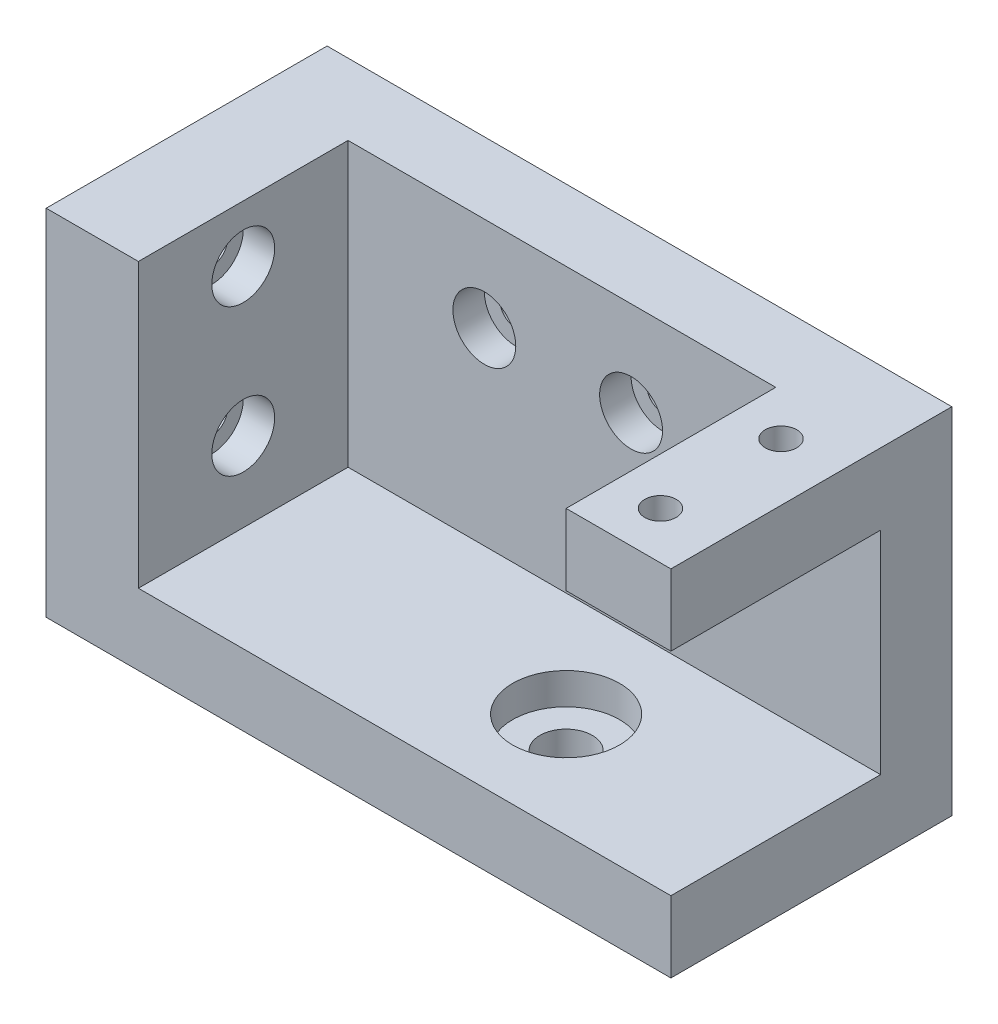
ISO-10303-21;
HEADER;
FILE_DESCRIPTION(('STEP AP214'),'2;1');
FILE_NAME('part.step','',(''),(''),'','','');
FILE_SCHEMA(('AUTOMOTIVE_DESIGN { 1 0 10303 214 1 1 1 1 }'));
ENDSEC;
DATA;
#1=APPLICATION_CONTEXT('core data for automotive mechanical design processes');
#2=APPLICATION_PROTOCOL_DEFINITION('international standard','automotive_design',2000,#1);
#3=PRODUCT_CONTEXT('',#1,'mechanical');
#4=PRODUCT('Part','Part','',(#3));
#5=PRODUCT_RELATED_PRODUCT_CATEGORY('part','',(#4));
#6=PRODUCT_DEFINITION_FORMATION('','',#4);
#7=PRODUCT_DEFINITION_CONTEXT('part definition',#1,'design');
#8=PRODUCT_DEFINITION('design','',#6,#7);
#9=PRODUCT_DEFINITION_SHAPE('','',#8);
#10=(LENGTH_UNIT() NAMED_UNIT(*) SI_UNIT(.MILLI.,.METRE.));
#11=(NAMED_UNIT(*) PLANE_ANGLE_UNIT() SI_UNIT($,.RADIAN.));
#12=(NAMED_UNIT(*) SI_UNIT($,.STERADIAN.) SOLID_ANGLE_UNIT());
#13=UNCERTAINTY_MEASURE_WITH_UNIT(LENGTH_MEASURE(1.E-05),#10,'distance_accuracy_value','');
#14=(GEOMETRIC_REPRESENTATION_CONTEXT(3) GLOBAL_UNCERTAINTY_ASSIGNED_CONTEXT((#13)) GLOBAL_UNIT_ASSIGNED_CONTEXT((#10,
#11,#12)) REPRESENTATION_CONTEXT('',''));
#15=CARTESIAN_POINT('',(0.,0.,0.));
#16=DIRECTION('',(0.,0.,1.));
#17=DIRECTION('',(1.,0.,0.));
#18=AXIS2_PLACEMENT_3D('',#15,#16,#17);
#19=CARTESIAN_POINT('',(-0.0901204819277052,12.9821686746974,3.2));
#20=DIRECTION('',(0.,0.,-1.));
#21=DIRECTION('',(0.,1.,0.));
#22=AXIS2_PLACEMENT_3D('',#19,#20,#21);
#23=CYLINDRICAL_SURFACE('',#22,1.5);
#24=CARTESIAN_POINT('',(-0.0901204819277052,12.9821686746974,-6.8));
#25=DIRECTION('',(0.,0.,-1.));
#26=DIRECTION('',(0.,1.,0.));
#27=AXIS2_PLACEMENT_3D('',#24,#25,#26);
#28=CIRCLE('',#27,1.5);
#29=CARTESIAN_POINT('',(-0.0901204819277052,14.4821686746974,-6.8));
#30=VERTEX_POINT('',#29);
#31=EDGE_CURVE('E177',#30,#30,#28,.T.);
#32=ORIENTED_EDGE('',*,*,#31,.T.);
#33=EDGE_LOOP('',(#32));
#34=FACE_BOUND('',#33,.T.);
#35=CARTESIAN_POINT('',(-0.0901204819277052,12.9821686746974,-3.));
#36=DIRECTION('',(0.,0.,1.));
#37=DIRECTION('',(1.,0.,0.));
#38=AXIS2_PLACEMENT_3D('',#35,#36,#37);
#39=CIRCLE('',#38,1.5);
#40=CARTESIAN_POINT('',(1.4098795180723,12.9821686746974,-3.));
#41=VERTEX_POINT('',#40);
#42=EDGE_CURVE('E47',#41,#41,#39,.F.);
#43=ORIENTED_EDGE('',*,*,#42,.F.);
#44=EDGE_LOOP('',(#43));
#45=FACE_BOUND('',#44,.T.);
#46=ADVANCED_FACE('F43',(#34,#45),#23,.F.);
#47=CARTESIAN_POINT('',(13.9098795180723,12.9821686746974,3.2));
#48=DIRECTION('',(0.,0.,-1.));
#49=DIRECTION('',(0.,1.,0.));
#50=AXIS2_PLACEMENT_3D('',#47,#48,#49);
#51=CYLINDRICAL_SURFACE('',#50,1.5);
#52=CARTESIAN_POINT('',(13.9098795180723,12.9821686746974,-6.8));
#53=DIRECTION('',(0.,0.,-1.));
#54=DIRECTION('',(0.,1.,0.));
#55=AXIS2_PLACEMENT_3D('',#52,#53,#54);
#56=CIRCLE('',#55,1.5);
#57=CARTESIAN_POINT('',(13.9098795180723,14.4821686746974,-6.8));
#58=VERTEX_POINT('',#57);
#59=EDGE_CURVE('E180',#58,#58,#56,.T.);
#60=ORIENTED_EDGE('',*,*,#59,.T.);
#61=EDGE_LOOP('',(#60));
#62=FACE_BOUND('',#61,.T.);
#63=CARTESIAN_POINT('',(13.9098795180723,12.9821686746974,-3.));
#64=DIRECTION('',(0.,0.,1.));
#65=DIRECTION('',(1.,0.,0.));
#66=AXIS2_PLACEMENT_3D('',#63,#64,#65);
#67=CIRCLE('',#66,1.5);
#68=CARTESIAN_POINT('',(15.4098795180723,12.9821686746974,-3.));
#69=VERTEX_POINT('',#68);
#70=EDGE_CURVE('E139',#69,#69,#67,.F.);
#71=ORIENTED_EDGE('',*,*,#70,.F.);
#72=EDGE_LOOP('',(#71));
#73=FACE_BOUND('',#72,.T.);
#74=ADVANCED_FACE('F269',(#62,#73),#51,.F.);
#75=CARTESIAN_POINT('',(-11.8901204819277,16.5821686746975,10.));
#76=DIRECTION('',(-1.,0.,0.));
#77=DIRECTION('',(0.,-1.,0.));
#78=AXIS2_PLACEMENT_3D('',#75,#76,#77);
#79=CYLINDRICAL_SURFACE('',#78,1.5);
#80=CARTESIAN_POINT('',(-21.8901204819277,16.5821686746975,10.));
#81=DIRECTION('',(-1.,0.,0.));
#82=DIRECTION('',(0.,-1.,0.));
#83=AXIS2_PLACEMENT_3D('',#80,#81,#82);
#84=CIRCLE('',#83,1.5);
#85=CARTESIAN_POINT('',(-21.8901204819277,15.0821686746975,10.));
#86=VERTEX_POINT('',#85);
#87=EDGE_CURVE('E138',#86,#86,#84,.T.);
#88=ORIENTED_EDGE('',*,*,#87,.T.);
#89=EDGE_LOOP('',(#88));
#90=FACE_BOUND('',#89,.T.);
#91=CARTESIAN_POINT('',(-16.0901204819277,16.5821686746975,10.));
#92=DIRECTION('',(1.,0.,0.));
#93=DIRECTION('',(0.,1.,0.));
#94=AXIS2_PLACEMENT_3D('',#91,#92,#93);
#95=CIRCLE('',#94,1.5);
#96=CARTESIAN_POINT('',(-16.0901204819277,18.0821686746975,10.));
#97=VERTEX_POINT('',#96);
#98=EDGE_CURVE('E135',#97,#97,#95,.F.);
#99=ORIENTED_EDGE('',*,*,#98,.F.);
#100=EDGE_LOOP('',(#99));
#101=FACE_BOUND('',#100,.T.);
#102=ADVANCED_FACE('F275',(#90,#101),#79,.F.);
#103=CARTESIAN_POINT('',(-11.8901204819278,2.58216867469745,10.));
#104=DIRECTION('',(-1.,0.,0.));
#105=DIRECTION('',(0.,-1.,0.));
#106=AXIS2_PLACEMENT_3D('',#103,#104,#105);
#107=CYLINDRICAL_SURFACE('',#106,1.5);
#108=CARTESIAN_POINT('',(-21.8901204819278,2.58216867469746,10.));
#109=DIRECTION('',(-1.,0.,0.));
#110=DIRECTION('',(0.,-1.,0.));
#111=AXIS2_PLACEMENT_3D('',#108,#109,#110);
#112=CIRCLE('',#111,1.5);
#113=CARTESIAN_POINT('',(-21.8901204819278,1.08216867469746,10.));
#114=VERTEX_POINT('',#113);
#115=EDGE_CURVE('E174',#114,#114,#112,.T.);
#116=ORIENTED_EDGE('',*,*,#115,.T.);
#117=EDGE_LOOP('',(#116));
#118=FACE_BOUND('',#117,.T.);
#119=CARTESIAN_POINT('',(-16.0901204819277,2.58216867469745,10.));
#120=DIRECTION('',(1.,0.,0.));
#121=DIRECTION('',(0.,1.,0.));
#122=AXIS2_PLACEMENT_3D('',#119,#120,#121);
#123=CIRCLE('',#122,1.5);
#124=CARTESIAN_POINT('',(-16.0901204819277,4.08216867469745,10.));
#125=VERTEX_POINT('',#124);
#126=EDGE_CURVE('E132',#125,#125,#123,.F.);
#127=ORIENTED_EDGE('',*,*,#126,.F.);
#128=EDGE_LOOP('',(#127));
#129=FACE_BOUND('',#128,.T.);
#130=ADVANCED_FACE('F264',(#118,#129),#107,.F.);
#131=CARTESIAN_POINT('',(33.7098795180723,21.9821686746975,0.));
#132=DIRECTION('',(0.,0.,-1.));
#133=DIRECTION('',(0.,1.,0.));
#134=AXIS2_PLACEMENT_3D('',#131,#132,#133);
#135=PLANE('',#134);
#136=CARTESIAN_POINT('',(-0.0901204819277052,12.9821686746974,0.));
#137=DIRECTION('',(0.,0.,1.));
#138=DIRECTION('',(1.,0.,0.));
#139=AXIS2_PLACEMENT_3D('',#136,#137,#138);
#140=CIRCLE('',#139,3.);
#141=CARTESIAN_POINT('',(2.9098795180723,12.9821686746974,0.));
#142=VERTEX_POINT('',#141);
#143=EDGE_CURVE('E147',#142,#142,#140,.T.);
#144=ORIENTED_EDGE('',*,*,#143,.F.);
#145=EDGE_LOOP('',(#144));
#146=FACE_BOUND('',#145,.T.);
#147=CARTESIAN_POINT('',(13.9098795180723,12.9821686746974,0.));
#148=DIRECTION('',(0.,0.,1.));
#149=DIRECTION('',(1.,0.,0.));
#150=AXIS2_PLACEMENT_3D('',#147,#148,#149);
#151=CIRCLE('',#150,3.);
#152=CARTESIAN_POINT('',(16.9098795180723,12.9821686746974,0.));
#153=VERTEX_POINT('',#152);
#154=EDGE_CURVE('E160',#153,#153,#151,.T.);
#155=ORIENTED_EDGE('',*,*,#154,.F.);
#156=EDGE_LOOP('',(#155));
#157=FACE_BOUND('',#156,.T.);
#158=DIRECTION('',(0.,1.,0.));
#159=VECTOR('',#158,1.);
#160=CARTESIAN_POINT('',(-13.0901204819277,21.9821686746974,0.));
#161=LINE('',#160,#159);
#162=CARTESIAN_POINT('',(-13.0901204819278,-5.01783132530256,0.));
#163=VERTEX_POINT('',#162);
#164=CARTESIAN_POINT('',(-13.0901204819277,21.9821686746974,0.));
#165=VERTEX_POINT('',#164);
#166=EDGE_CURVE('E60',#163,#165,#161,.T.);
#167=ORIENTED_EDGE('',*,*,#166,.F.);
#168=DIRECTION('',(1.,0.,0.));
#169=VECTOR('',#168,1.);
#170=CARTESIAN_POINT('',(-19.0867425741607,-5.01783132530256,0.));
#171=LINE('',#170,#169);
#172=CARTESIAN_POINT('',(37.7098795180722,-5.0178313253012,0.));
#173=VERTEX_POINT('',#172);
#174=EDGE_CURVE('E206',#163,#173,#171,.T.);
#175=ORIENTED_EDGE('',*,*,#174,.T.);
#176=DIRECTION('',(0.,-1.,0.));
#177=VECTOR('',#176,1.);
#178=CARTESIAN_POINT('',(37.7098795180722,0.,0.));
#179=LINE('',#178,#177);
#180=CARTESIAN_POINT('',(37.7098795180723,15.1821686746974,0.));
#181=VERTEX_POINT('',#180);
#182=EDGE_CURVE('E233',#181,#173,#179,.T.);
#183=ORIENTED_EDGE('',*,*,#182,.F.);
#184=DIRECTION('',(1.,0.,0.));
#185=VECTOR('',#184,1.);
#186=CARTESIAN_POINT('',(-19.0867425741607,15.1821686746974,0.));
#187=LINE('',#186,#185);
#188=CARTESIAN_POINT('',(27.7132574258393,15.1821686746974,0.));
#189=VERTEX_POINT('',#188);
#190=EDGE_CURVE('E203',#189,#181,#187,.T.);
#191=ORIENTED_EDGE('',*,*,#190,.F.);
#192=DIRECTION('',(0.,-1.,0.));
#193=VECTOR('',#192,1.);
#194=CARTESIAN_POINT('',(27.7132574258393,21.9821686746974,0.));
#195=LINE('',#194,#193);
#196=CARTESIAN_POINT('',(27.7132574258393,21.9821686746974,0.));
#197=VERTEX_POINT('',#196);
#198=EDGE_CURVE('E86',#197,#189,#195,.T.);
#199=ORIENTED_EDGE('',*,*,#198,.F.);
#200=DIRECTION('',(-1.,0.,0.));
#201=VECTOR('',#200,1.);
#202=CARTESIAN_POINT('',(33.7098795180723,21.9821686746975,0.));
#203=LINE('',#202,#201);
#204=EDGE_CURVE('E92',#197,#165,#203,.T.);
#205=ORIENTED_EDGE('',*,*,#204,.T.);
#206=EDGE_LOOP('',(#167,#175,#183,#191,#199,#205));
#207=FACE_BOUND('',#206,.T.);
#208=ADVANCED_FACE('F97',(#146,#157,#207),#135,.F.);
#209=CARTESIAN_POINT('',(-19.0867425741607,-5.01783132530256,20.));
#210=DIRECTION('',(0.,-1.,0.));
#211=DIRECTION('',(0.,0.,-1.));
#212=AXIS2_PLACEMENT_3D('',#209,#210,#211);
#213=PLANE('',#212);
#214=CARTESIAN_POINT('',(17.7132574258393,-5.01783132530256,10.));
#215=DIRECTION('',(0.,1.,0.));
#216=DIRECTION('',(0.,0.,1.));
#217=AXIS2_PLACEMENT_3D('',#214,#215,#216);
#218=CIRCLE('',#217,5.1);
#219=CARTESIAN_POINT('',(17.7132574258393,-5.01783132530256,15.1));
#220=VERTEX_POINT('',#219);
#221=EDGE_CURVE('E155',#220,#220,#218,.T.);
#222=ORIENTED_EDGE('',*,*,#221,.F.);
#223=EDGE_LOOP('',(#222));
#224=FACE_BOUND('',#223,.T.);
#225=DIRECTION('',(0.,0.,-1.));
#226=VECTOR('',#225,1.);
#227=CARTESIAN_POINT('',(-13.0901204819278,-5.01783132530233,20.));
#228=LINE('',#227,#226);
#229=CARTESIAN_POINT('',(-13.0901204819278,-5.01783132530233,20.));
#230=VERTEX_POINT('',#229);
#231=EDGE_CURVE('E84',#230,#163,#228,.T.);
#232=ORIENTED_EDGE('',*,*,#231,.F.);
#233=DIRECTION('',(1.,0.,0.));
#234=VECTOR('',#233,1.);
#235=CARTESIAN_POINT('',(-19.0867425741607,-5.01783132530256,20.));
#236=LINE('',#235,#234);
#237=CARTESIAN_POINT('',(37.7098795180723,-5.0178313253012,20.));
#238=VERTEX_POINT('',#237);
#239=EDGE_CURVE('E126',#230,#238,#236,.T.);
#240=ORIENTED_EDGE('',*,*,#239,.T.);
#241=DIRECTION('',(0.,0.,-1.));
#242=VECTOR('',#241,1.);
#243=CARTESIAN_POINT('',(37.7098795180722,-5.0178313253012,0.));
#244=LINE('',#243,#242);
#245=EDGE_CURVE('E215',#238,#173,#244,.T.);
#246=ORIENTED_EDGE('',*,*,#245,.T.);
#247=ORIENTED_EDGE('',*,*,#174,.F.);
#248=EDGE_LOOP('',(#232,#240,#246,#247));
#249=FACE_BOUND('',#248,.T.);
#250=ADVANCED_FACE('F212',(#224,#249),#213,.F.);
#251=CARTESIAN_POINT('',(0.,0.,20.));
#252=DIRECTION('',(0.,0.,1.));
#253=DIRECTION('',(1.,0.,0.));
#254=AXIS2_PLACEMENT_3D('',#251,#252,#253);
#255=PLANE('',#254);
#256=DIRECTION('',(-1.,0.,0.));
#257=VECTOR('',#256,1.);
#258=CARTESIAN_POINT('',(-19.8901204819277,21.9821686746974,20.));
#259=LINE('',#258,#257);
#260=CARTESIAN_POINT('',(-13.0901204819277,21.9821686746974,20.));
#261=VERTEX_POINT('',#260);
#262=CARTESIAN_POINT('',(-21.8901204819277,21.9821686746975,20.));
#263=VERTEX_POINT('',#262);
#264=EDGE_CURVE('E94',#261,#263,#259,.T.);
#265=ORIENTED_EDGE('',*,*,#264,.T.);
#266=DIRECTION('',(0.,1.,0.));
#267=VECTOR('',#266,1.);
#268=CARTESIAN_POINT('',(-21.8901204819278,-11.8178313253025,20.));
#269=LINE('',#268,#267);
#270=CARTESIAN_POINT('',(-21.8901204819278,-11.8178313253025,20.));
#271=VERTEX_POINT('',#270);
#272=EDGE_CURVE('E194',#271,#263,#269,.T.);
#273=ORIENTED_EDGE('',*,*,#272,.F.);
#274=DIRECTION('',(1.,0.,0.));
#275=VECTOR('',#274,1.);
#276=CARTESIAN_POINT('',(-19.8901204819277,-11.8178313253026,20.));
#277=LINE('',#276,#275);
#278=CARTESIAN_POINT('',(37.7098795180722,-11.8178313253026,20.));
#279=VERTEX_POINT('',#278);
#280=EDGE_CURVE('E85',#271,#279,#277,.T.);
#281=ORIENTED_EDGE('',*,*,#280,.T.);
#282=DIRECTION('',(0.,-1.,0.));
#283=VECTOR('',#282,1.);
#284=CARTESIAN_POINT('',(37.7098795180723,0.,20.));
#285=LINE('',#284,#283);
#286=EDGE_CURVE('E220',#238,#279,#285,.T.);
#287=ORIENTED_EDGE('',*,*,#286,.F.);
#288=ORIENTED_EDGE('',*,*,#239,.F.);
#289=DIRECTION('',(0.,1.,0.));
#290=VECTOR('',#289,1.);
#291=CARTESIAN_POINT('',(-13.0901204819277,21.9821686746974,20.));
#292=LINE('',#291,#290);
#293=EDGE_CURVE('E69',#230,#261,#292,.T.);
#294=ORIENTED_EDGE('',*,*,#293,.T.);
#295=EDGE_LOOP('',(#265,#273,#281,#287,#288,#294));
#296=FACE_BOUND('',#295,.T.);
#297=ADVANCED_FACE('F221',(#296),#255,.T.);
#298=DIRECTION('',(1.,0.,0.));
#299=VECTOR('',#298,1.);
#300=CARTESIAN_POINT('',(-19.0867425741607,15.1821686746974,20.));
#301=LINE('',#300,#299);
#302=CARTESIAN_POINT('',(27.7132574258393,15.1821686746974,20.));
#303=VERTEX_POINT('',#302);
#304=CARTESIAN_POINT('',(37.7098795180723,15.1821686746974,20.));
#305=VERTEX_POINT('',#304);
#306=EDGE_CURVE('E107',#303,#305,#301,.T.);
#307=ORIENTED_EDGE('',*,*,#306,.T.);
#308=DIRECTION('',(0.,-1.,0.));
#309=VECTOR('',#308,1.);
#310=CARTESIAN_POINT('',(37.7098795180723,0.,20.));
#311=LINE('',#310,#309);
#312=CARTESIAN_POINT('',(37.7098795180723,21.9821686746974,20.));
#313=VERTEX_POINT('',#312);
#314=EDGE_CURVE('E246',#313,#305,#311,.T.);
#315=ORIENTED_EDGE('',*,*,#314,.F.);
#316=DIRECTION('',(-1.,0.,0.));
#317=VECTOR('',#316,1.);
#318=CARTESIAN_POINT('',(27.7132574258393,21.9821686746974,20.));
#319=LINE('',#318,#317);
#320=CARTESIAN_POINT('',(27.7132574258393,21.9821686746974,20.));
#321=VERTEX_POINT('',#320);
#322=EDGE_CURVE('E115',#313,#321,#319,.T.);
#323=ORIENTED_EDGE('',*,*,#322,.T.);
#324=DIRECTION('',(0.,-1.,0.));
#325=VECTOR('',#324,1.);
#326=CARTESIAN_POINT('',(27.7132574258393,21.9821686746974,20.));
#327=LINE('',#326,#325);
#328=EDGE_CURVE('E117',#321,#303,#327,.T.);
#329=ORIENTED_EDGE('',*,*,#328,.T.);
#330=EDGE_LOOP('',(#307,#315,#323,#329));
#331=FACE_BOUND('',#330,.T.);
#332=ADVANCED_FACE('F262',(#331),#255,.T.);
#333=CARTESIAN_POINT('',(-21.8901204819278,-11.8178313253025,-6.8));
#334=DIRECTION('',(-1.,0.,0.));
#335=DIRECTION('',(0.,-1.,0.));
#336=AXIS2_PLACEMENT_3D('',#333,#334,#335);
#337=PLANE('',#336);
#338=ORIENTED_EDGE('',*,*,#115,.F.);
#339=EDGE_LOOP('',(#338));
#340=FACE_BOUND('',#339,.T.);
#341=ORIENTED_EDGE('',*,*,#87,.F.);
#342=EDGE_LOOP('',(#341));
#343=FACE_BOUND('',#342,.T.);
#344=ORIENTED_EDGE('',*,*,#272,.T.);
#345=DIRECTION('',(0.,0.,1.));
#346=VECTOR('',#345,1.);
#347=CARTESIAN_POINT('',(-21.8901204819277,21.9821686746975,-6.8));
#348=LINE('',#347,#346);
#349=CARTESIAN_POINT('',(-21.8901204819277,21.9821686746975,-6.8));
#350=VERTEX_POINT('',#349);
#351=EDGE_CURVE('E188',#350,#263,#348,.T.);
#352=ORIENTED_EDGE('',*,*,#351,.F.);
#353=DIRECTION('',(0.,1.,0.));
#354=VECTOR('',#353,1.);
#355=CARTESIAN_POINT('',(-21.8901204819278,-11.8178313253025,-6.8));
#356=LINE('',#355,#354);
#357=CARTESIAN_POINT('',(-21.8901204819278,-11.8178313253025,-6.8));
#358=VERTEX_POINT('',#357);
#359=EDGE_CURVE('E192',#358,#350,#356,.T.);
#360=ORIENTED_EDGE('',*,*,#359,.F.);
#361=DIRECTION('',(0.,0.,1.));
#362=VECTOR('',#361,1.);
#363=CARTESIAN_POINT('',(-21.8901204819278,-11.8178313253025,-6.8));
#364=LINE('',#363,#362);
#365=EDGE_CURVE('E189',#358,#271,#364,.T.);
#366=ORIENTED_EDGE('',*,*,#365,.T.);
#367=EDGE_LOOP('',(#344,#352,#360,#366));
#368=FACE_BOUND('',#367,.T.);
#369=ADVANCED_FACE('F287',(#340,#343,#368),#337,.T.);
#370=CARTESIAN_POINT('',(-19.8901204819277,-11.8178313253026,20.));
#371=DIRECTION('',(0.,1.,0.));
#372=DIRECTION('',(0.,0.,1.));
#373=AXIS2_PLACEMENT_3D('',#370,#371,#372);
#374=PLANE('',#373);
#375=DIRECTION('',(-1.,0.,0.));
#376=VECTOR('',#375,1.);
#377=CARTESIAN_POINT('',(33.7098795180723,-11.8178313253025,-6.8));
#378=LINE('',#377,#376);
#379=CARTESIAN_POINT('',(37.7098795180722,-11.8178313253026,-6.8));
#380=VERTEX_POINT('',#379);
#381=EDGE_CURVE('E104',#380,#358,#378,.T.);
#382=ORIENTED_EDGE('',*,*,#381,.F.);
#383=DIRECTION('',(0.,0.,-1.));
#384=VECTOR('',#383,1.);
#385=CARTESIAN_POINT('',(37.7098795180722,-11.8178313253026,0.));
#386=LINE('',#385,#384);
#387=EDGE_CURVE('E227',#279,#380,#386,.T.);
#388=ORIENTED_EDGE('',*,*,#387,.F.);
#389=ORIENTED_EDGE('',*,*,#280,.F.);
#390=ORIENTED_EDGE('',*,*,#365,.F.);
#391=EDGE_LOOP('',(#382,#388,#389,#390));
#392=FACE_BOUND('',#391,.T.);
#393=CARTESIAN_POINT('',(17.7132574258393,-11.8178313253026,10.));
#394=DIRECTION('',(0.,1.,0.));
#395=DIRECTION('',(0.,0.,1.));
#396=AXIS2_PLACEMENT_3D('',#393,#394,#395);
#397=CIRCLE('',#396,2.5);
#398=CARTESIAN_POINT('',(17.7132574258393,-11.8178313253026,12.5));
#399=VERTEX_POINT('',#398);
#400=EDGE_CURVE('E123',#399,#399,#397,.T.);
#401=ORIENTED_EDGE('',*,*,#400,.T.);
#402=EDGE_LOOP('',(#401));
#403=FACE_BOUND('',#402,.T.);
#404=ADVANCED_FACE('F45',(#392,#403),#374,.F.);
#405=CARTESIAN_POINT('',(27.7132574258393,21.9821686746974,20.));
#406=DIRECTION('',(1.,0.,0.));
#407=DIRECTION('',(0.,0.,-1.));
#408=AXIS2_PLACEMENT_3D('',#405,#406,#407);
#409=PLANE('',#408);
#410=ORIENTED_EDGE('',*,*,#198,.T.);
#411=DIRECTION('',(0.,0.,1.));
#412=VECTOR('',#411,1.);
#413=CARTESIAN_POINT('',(27.7132574258393,15.1821686746974,20.));
#414=LINE('',#413,#412);
#415=EDGE_CURVE('E101',#189,#303,#414,.T.);
#416=ORIENTED_EDGE('',*,*,#415,.T.);
#417=ORIENTED_EDGE('',*,*,#328,.F.);
#418=DIRECTION('',(0.,0.,-1.));
#419=VECTOR('',#418,1.);
#420=CARTESIAN_POINT('',(27.7132574258393,21.9821686746974,20.));
#421=LINE('',#420,#419);
#422=EDGE_CURVE('E12',#321,#197,#421,.T.);
#423=ORIENTED_EDGE('',*,*,#422,.T.);
#424=EDGE_LOOP('',(#410,#416,#417,#423));
#425=FACE_BOUND('',#424,.T.);
#426=ADVANCED_FACE('F337',(#425),#409,.F.);
#427=CARTESIAN_POINT('',(-13.0901204819277,21.9821686746974,20.));
#428=DIRECTION('',(-1.,0.,0.));
#429=DIRECTION('',(0.,-1.,0.));
#430=AXIS2_PLACEMENT_3D('',#427,#428,#429);
#431=PLANE('',#430);
#432=CARTESIAN_POINT('',(-13.0901204819277,2.58216867469745,10.));
#433=DIRECTION('',(1.,0.,0.));
#434=DIRECTION('',(0.,1.,0.));
#435=AXIS2_PLACEMENT_3D('',#432,#433,#434);
#436=CIRCLE('',#435,3.);
#437=CARTESIAN_POINT('',(-13.0901204819277,5.58216867469745,10.));
#438=VERTEX_POINT('',#437);
#439=EDGE_CURVE('E166',#438,#438,#436,.T.);
#440=ORIENTED_EDGE('',*,*,#439,.F.);
#441=EDGE_LOOP('',(#440));
#442=FACE_BOUND('',#441,.T.);
#443=CARTESIAN_POINT('',(-13.0901204819277,16.5821686746975,10.));
#444=DIRECTION('',(1.,0.,0.));
#445=DIRECTION('',(0.,1.,0.));
#446=AXIS2_PLACEMENT_3D('',#443,#444,#445);
#447=CIRCLE('',#446,3.);
#448=CARTESIAN_POINT('',(-13.0901204819277,19.5821686746975,10.));
#449=VERTEX_POINT('',#448);
#450=EDGE_CURVE('E145',#449,#449,#447,.T.);
#451=ORIENTED_EDGE('',*,*,#450,.F.);
#452=EDGE_LOOP('',(#451));
#453=FACE_BOUND('',#452,.T.);
#454=ORIENTED_EDGE('',*,*,#293,.F.);
#455=ORIENTED_EDGE('',*,*,#231,.T.);
#456=ORIENTED_EDGE('',*,*,#166,.T.);
#457=DIRECTION('',(0.,0.,-1.));
#458=VECTOR('',#457,1.);
#459=CARTESIAN_POINT('',(-13.0901204819277,21.9821686746974,20.));
#460=LINE('',#459,#458);
#461=EDGE_CURVE('E52',#261,#165,#460,.T.);
#462=ORIENTED_EDGE('',*,*,#461,.F.);
#463=EDGE_LOOP('',(#454,#455,#456,#462));
#464=FACE_BOUND('',#463,.T.);
#465=ADVANCED_FACE('F81',(#442,#453,#464),#431,.F.);
#466=CARTESIAN_POINT('',(-19.8901204819277,21.9821686746974,20.));
#467=DIRECTION('',(0.,-1.,0.));
#468=DIRECTION('',(1.,0.,0.));
#469=AXIS2_PLACEMENT_3D('',#466,#467,#468);
#470=PLANE('',#469);
#471=CARTESIAN_POINT('',(32.2132574258393,21.9821686746975,4.));
#472=DIRECTION('',(0.,1.,0.));
#473=DIRECTION('',(-1.,0.,0.));
#474=AXIS2_PLACEMENT_3D('',#471,#472,#473);
#475=CIRCLE('',#474,1.5);
#476=CARTESIAN_POINT('',(30.7132574258393,21.9821686746975,4.));
#477=VERTEX_POINT('',#476);
#478=EDGE_CURVE('E320',#477,#477,#475,.T.);
#479=ORIENTED_EDGE('',*,*,#478,.F.);
#480=EDGE_LOOP('',(#479));
#481=FACE_BOUND('',#480,.T.);
#482=CARTESIAN_POINT('',(32.2132574258393,21.9821686746975,15.5));
#483=DIRECTION('',(0.,1.,0.));
#484=DIRECTION('',(-1.,0.,0.));
#485=AXIS2_PLACEMENT_3D('',#482,#483,#484);
#486=CIRCLE('',#485,1.5);
#487=CARTESIAN_POINT('',(30.7132574258393,21.9821686746975,15.5));
#488=VERTEX_POINT('',#487);
#489=EDGE_CURVE('E131',#488,#488,#486,.T.);
#490=ORIENTED_EDGE('',*,*,#489,.F.);
#491=EDGE_LOOP('',(#490));
#492=FACE_BOUND('',#491,.T.);
#493=ORIENTED_EDGE('',*,*,#422,.F.);
#494=ORIENTED_EDGE('',*,*,#322,.F.);
#495=DIRECTION('',(0.,0.,1.));
#496=VECTOR('',#495,1.);
#497=CARTESIAN_POINT('',(37.7098795180723,21.9821686746974,0.));
#498=LINE('',#497,#496);
#499=CARTESIAN_POINT('',(37.7098795180723,21.9821686746974,-6.8));
#500=VERTEX_POINT('',#499);
#501=EDGE_CURVE('E243',#500,#313,#498,.T.);
#502=ORIENTED_EDGE('',*,*,#501,.F.);
#503=DIRECTION('',(-1.,0.,0.));
#504=VECTOR('',#503,1.);
#505=CARTESIAN_POINT('',(33.7098795180723,21.9821686746975,-6.8));
#506=LINE('',#505,#504);
#507=EDGE_CURVE('E100',#500,#350,#506,.T.);
#508=ORIENTED_EDGE('',*,*,#507,.T.);
#509=ORIENTED_EDGE('',*,*,#351,.T.);
#510=ORIENTED_EDGE('',*,*,#264,.F.);
#511=ORIENTED_EDGE('',*,*,#461,.T.);
#512=ORIENTED_EDGE('',*,*,#204,.F.);
#513=EDGE_LOOP('',(#493,#494,#502,#508,#509,#510,#511,#512));
#514=FACE_BOUND('',#513,.T.);
#515=ADVANCED_FACE('F91',(#481,#492,#514),#470,.F.);
#516=CARTESIAN_POINT('',(33.7098795180723,21.9821686746975,-6.8));
#517=DIRECTION('',(0.,0.,-1.));
#518=DIRECTION('',(0.,1.,0.));
#519=AXIS2_PLACEMENT_3D('',#516,#517,#518);
#520=PLANE('',#519);
#521=ORIENTED_EDGE('',*,*,#59,.F.);
#522=EDGE_LOOP('',(#521));
#523=FACE_BOUND('',#522,.T.);
#524=ORIENTED_EDGE('',*,*,#31,.F.);
#525=EDGE_LOOP('',(#524));
#526=FACE_BOUND('',#525,.T.);
#527=ORIENTED_EDGE('',*,*,#381,.T.);
#528=ORIENTED_EDGE('',*,*,#359,.T.);
#529=ORIENTED_EDGE('',*,*,#507,.F.);
#530=DIRECTION('',(0.,1.,0.));
#531=VECTOR('',#530,1.);
#532=CARTESIAN_POINT('',(37.7098795180722,0.,-6.8));
#533=LINE('',#532,#531);
#534=EDGE_CURVE('E240',#380,#500,#533,.T.);
#535=ORIENTED_EDGE('',*,*,#534,.F.);
#536=EDGE_LOOP('',(#527,#528,#529,#535));
#537=FACE_BOUND('',#536,.T.);
#538=ADVANCED_FACE('F299',(#523,#526,#537),#520,.T.);
#539=CARTESIAN_POINT('',(-19.0867425741607,15.1821686746974,20.));
#540=DIRECTION('',(0.,1.,0.));
#541=DIRECTION('',(0.,0.,1.));
#542=AXIS2_PLACEMENT_3D('',#539,#540,#541);
#543=PLANE('',#542);
#544=CARTESIAN_POINT('',(32.2132574258393,15.1821686746975,4.));
#545=DIRECTION('',(0.,1.,0.));
#546=DIRECTION('',(-1.,0.,0.));
#547=AXIS2_PLACEMENT_3D('',#544,#545,#546);
#548=CIRCLE('',#547,1.5);
#549=CARTESIAN_POINT('',(30.7132574258393,15.1821686746975,4.));
#550=VERTEX_POINT('',#549);
#551=EDGE_CURVE('E309',#550,#550,#548,.T.);
#552=ORIENTED_EDGE('',*,*,#551,.T.);
#553=EDGE_LOOP('',(#552));
#554=FACE_BOUND('',#553,.T.);
#555=CARTESIAN_POINT('',(32.2132574258393,15.1821686746974,15.5));
#556=DIRECTION('',(0.,1.,0.));
#557=DIRECTION('',(0.,0.,1.));
#558=AXIS2_PLACEMENT_3D('',#555,#556,#557);
#559=CIRCLE('',#558,1.5);
#560=CARTESIAN_POINT('',(32.2132574258393,15.1821686746974,17.));
#561=VERTEX_POINT('',#560);
#562=EDGE_CURVE('E128',#561,#561,#559,.T.);
#563=ORIENTED_EDGE('',*,*,#562,.T.);
#564=EDGE_LOOP('',(#563));
#565=FACE_BOUND('',#564,.T.);
#566=ORIENTED_EDGE('',*,*,#190,.T.);
#567=DIRECTION('',(0.,0.,-1.));
#568=VECTOR('',#567,1.);
#569=CARTESIAN_POINT('',(37.7098795180723,15.1821686746974,0.));
#570=LINE('',#569,#568);
#571=EDGE_CURVE('E235',#305,#181,#570,.T.);
#572=ORIENTED_EDGE('',*,*,#571,.F.);
#573=ORIENTED_EDGE('',*,*,#306,.F.);
#574=ORIENTED_EDGE('',*,*,#415,.F.);
#575=EDGE_LOOP('',(#566,#572,#573,#574));
#576=FACE_BOUND('',#575,.T.);
#577=ADVANCED_FACE('F296',(#554,#565,#576),#543,.F.);
#578=CARTESIAN_POINT('',(0.,-8.01783132530256,0.));
#579=DIRECTION('',(0.,1.,0.));
#580=DIRECTION('',(0.,0.,1.));
#581=AXIS2_PLACEMENT_3D('',#578,#579,#580);
#582=PLANE('',#581);
#583=CARTESIAN_POINT('',(17.7132574258393,-8.01783132530256,10.));
#584=DIRECTION('',(0.,1.,0.));
#585=DIRECTION('',(0.,0.,1.));
#586=AXIS2_PLACEMENT_3D('',#583,#584,#585);
#587=CIRCLE('',#586,2.5);
#588=CARTESIAN_POINT('',(17.7132574258393,-8.01783132530256,12.5));
#589=VERTEX_POINT('',#588);
#590=EDGE_CURVE('E127',#589,#589,#587,.T.);
#591=ORIENTED_EDGE('',*,*,#590,.F.);
#592=EDGE_LOOP('',(#591));
#593=FACE_BOUND('',#592,.T.);
#594=CARTESIAN_POINT('',(17.7132574258393,-8.01783132530256,10.));
#595=DIRECTION('',(0.,1.,0.));
#596=DIRECTION('',(0.,0.,1.));
#597=AXIS2_PLACEMENT_3D('',#594,#595,#596);
#598=CIRCLE('',#597,5.1);
#599=CARTESIAN_POINT('',(17.7132574258393,-8.01783132530256,15.1));
#600=VERTEX_POINT('',#599);
#601=EDGE_CURVE('E163',#600,#600,#598,.T.);
#602=ORIENTED_EDGE('',*,*,#601,.T.);
#603=EDGE_LOOP('',(#602));
#604=FACE_BOUND('',#603,.T.);
#605=ADVANCED_FACE('F293',(#593,#604),#582,.T.);
#606=CARTESIAN_POINT('',(17.7132574258393,-28.0178313253026,10.));
#607=DIRECTION('',(0.,1.,0.));
#608=DIRECTION('',(0.,0.,1.));
#609=AXIS2_PLACEMENT_3D('',#606,#607,#608);
#610=CYLINDRICAL_SURFACE('',#609,2.5);
#611=ORIENTED_EDGE('',*,*,#590,.T.);
#612=EDGE_LOOP('',(#611));
#613=FACE_BOUND('',#612,.T.);
#614=ORIENTED_EDGE('',*,*,#400,.F.);
#615=EDGE_LOOP('',(#614));
#616=FACE_BOUND('',#615,.T.);
#617=ADVANCED_FACE('F285',(#613,#616),#610,.F.);
#618=CARTESIAN_POINT('',(32.2132574258393,11.9821686746975,15.5));
#619=DIRECTION('',(0.,1.,0.));
#620=DIRECTION('',(-1.,0.,0.));
#621=AXIS2_PLACEMENT_3D('',#618,#619,#620);
#622=CYLINDRICAL_SURFACE('',#621,1.5);
#623=ORIENTED_EDGE('',*,*,#489,.T.);
#624=EDGE_LOOP('',(#623));
#625=FACE_BOUND('',#624,.T.);
#626=ORIENTED_EDGE('',*,*,#562,.F.);
#627=EDGE_LOOP('',(#626));
#628=FACE_BOUND('',#627,.T.);
#629=ADVANCED_FACE('F281',(#625,#628),#622,.F.);
#630=CARTESIAN_POINT('',(-16.0901204819277,2.58216867469745,10.));
#631=DIRECTION('',(1.,0.,0.));
#632=DIRECTION('',(0.,1.,0.));
#633=AXIS2_PLACEMENT_3D('',#630,#631,#632);
#634=PLANE('',#633);
#635=CARTESIAN_POINT('',(-16.0901204819277,2.58216867469745,10.));
#636=DIRECTION('',(1.,0.,0.));
#637=DIRECTION('',(0.,1.,0.));
#638=AXIS2_PLACEMENT_3D('',#635,#636,#637);
#639=CIRCLE('',#638,3.);
#640=CARTESIAN_POINT('',(-16.0901204819277,5.58216867469745,10.));
#641=VERTEX_POINT('',#640);
#642=EDGE_CURVE('E136',#641,#641,#639,.T.);
#643=ORIENTED_EDGE('',*,*,#642,.T.);
#644=EDGE_LOOP('',(#643));
#645=FACE_BOUND('',#644,.T.);
#646=ORIENTED_EDGE('',*,*,#126,.T.);
#647=EDGE_LOOP('',(#646));
#648=FACE_BOUND('',#647,.T.);
#649=ADVANCED_FACE('F284',(#645,#648),#634,.T.);
#650=CARTESIAN_POINT('',(-16.0901204819277,2.58216867469745,10.));
#651=DIRECTION('',(1.,0.,0.));
#652=DIRECTION('',(0.,1.,0.));
#653=AXIS2_PLACEMENT_3D('',#650,#651,#652);
#654=CYLINDRICAL_SURFACE('',#653,3.);
#655=ORIENTED_EDGE('',*,*,#642,.F.);
#656=EDGE_LOOP('',(#655));
#657=FACE_BOUND('',#656,.T.);
#658=ORIENTED_EDGE('',*,*,#439,.T.);
#659=EDGE_LOOP('',(#658));
#660=FACE_BOUND('',#659,.T.);
#661=ADVANCED_FACE('F449',(#657,#660),#654,.F.);
#662=CARTESIAN_POINT('',(-16.0901204819277,16.5821686746975,10.));
#663=DIRECTION('',(1.,0.,0.));
#664=DIRECTION('',(0.,1.,0.));
#665=AXIS2_PLACEMENT_3D('',#662,#663,#664);
#666=PLANE('',#665);
#667=CARTESIAN_POINT('',(-16.0901204819277,16.5821686746975,10.));
#668=DIRECTION('',(1.,0.,0.));
#669=DIRECTION('',(0.,1.,0.));
#670=AXIS2_PLACEMENT_3D('',#667,#668,#669);
#671=CIRCLE('',#670,3.);
#672=CARTESIAN_POINT('',(-16.0901204819277,19.5821686746975,10.));
#673=VERTEX_POINT('',#672);
#674=EDGE_CURVE('E169',#673,#673,#671,.T.);
#675=ORIENTED_EDGE('',*,*,#674,.T.);
#676=EDGE_LOOP('',(#675));
#677=FACE_BOUND('',#676,.T.);
#678=ORIENTED_EDGE('',*,*,#98,.T.);
#679=EDGE_LOOP('',(#678));
#680=FACE_BOUND('',#679,.T.);
#681=ADVANCED_FACE('F453',(#677,#680),#666,.T.);
#682=CARTESIAN_POINT('',(-16.0901204819277,16.5821686746975,10.));
#683=DIRECTION('',(1.,0.,0.));
#684=DIRECTION('',(0.,1.,0.));
#685=AXIS2_PLACEMENT_3D('',#682,#683,#684);
#686=CYLINDRICAL_SURFACE('',#685,3.);
#687=ORIENTED_EDGE('',*,*,#674,.F.);
#688=EDGE_LOOP('',(#687));
#689=FACE_BOUND('',#688,.T.);
#690=ORIENTED_EDGE('',*,*,#450,.T.);
#691=EDGE_LOOP('',(#690));
#692=FACE_BOUND('',#691,.T.);
#693=ADVANCED_FACE('F442',(#689,#692),#686,.F.);
#694=CARTESIAN_POINT('',(13.9098795180723,12.9821686746974,-3.));
#695=DIRECTION('',(0.,0.,1.));
#696=DIRECTION('',(1.,0.,0.));
#697=AXIS2_PLACEMENT_3D('',#694,#695,#696);
#698=PLANE('',#697);
#699=CARTESIAN_POINT('',(13.9098795180723,12.9821686746974,-3.));
#700=DIRECTION('',(0.,0.,1.));
#701=DIRECTION('',(1.,0.,0.));
#702=AXIS2_PLACEMENT_3D('',#699,#700,#701);
#703=CIRCLE('',#702,3.);
#704=CARTESIAN_POINT('',(16.9098795180723,12.9821686746974,-3.));
#705=VERTEX_POINT('',#704);
#706=EDGE_CURVE('E152',#705,#705,#703,.T.);
#707=ORIENTED_EDGE('',*,*,#706,.T.);
#708=EDGE_LOOP('',(#707));
#709=FACE_BOUND('',#708,.T.);
#710=ORIENTED_EDGE('',*,*,#70,.T.);
#711=EDGE_LOOP('',(#710));
#712=FACE_BOUND('',#711,.T.);
#713=ADVANCED_FACE('F439',(#709,#712),#698,.T.);
#714=CARTESIAN_POINT('',(13.9098795180723,12.9821686746974,-3.));
#715=DIRECTION('',(0.,0.,1.));
#716=DIRECTION('',(1.,0.,0.));
#717=AXIS2_PLACEMENT_3D('',#714,#715,#716);
#718=CYLINDRICAL_SURFACE('',#717,3.);
#719=ORIENTED_EDGE('',*,*,#706,.F.);
#720=EDGE_LOOP('',(#719));
#721=FACE_BOUND('',#720,.T.);
#722=ORIENTED_EDGE('',*,*,#154,.T.);
#723=EDGE_LOOP('',(#722));
#724=FACE_BOUND('',#723,.T.);
#725=ADVANCED_FACE('F435',(#721,#724),#718,.F.);
#726=CARTESIAN_POINT('',(-0.0901204819277052,12.9821686746974,-3.));
#727=DIRECTION('',(0.,0.,1.));
#728=DIRECTION('',(1.,0.,0.));
#729=AXIS2_PLACEMENT_3D('',#726,#727,#728);
#730=PLANE('',#729);
#731=CARTESIAN_POINT('',(-0.0901204819277052,12.9821686746974,-3.));
#732=DIRECTION('',(0.,0.,1.));
#733=DIRECTION('',(1.,0.,0.));
#734=AXIS2_PLACEMENT_3D('',#731,#732,#733);
#735=CIRCLE('',#734,3.);
#736=CARTESIAN_POINT('',(2.9098795180723,12.9821686746974,-3.));
#737=VERTEX_POINT('',#736);
#738=EDGE_CURVE('E141',#737,#737,#735,.T.);
#739=ORIENTED_EDGE('',*,*,#738,.T.);
#740=EDGE_LOOP('',(#739));
#741=FACE_BOUND('',#740,.T.);
#742=ORIENTED_EDGE('',*,*,#42,.T.);
#743=EDGE_LOOP('',(#742));
#744=FACE_BOUND('',#743,.T.);
#745=ADVANCED_FACE('F432',(#741,#744),#730,.T.);
#746=CARTESIAN_POINT('',(-0.0901204819277052,12.9821686746974,-3.));
#747=DIRECTION('',(0.,0.,1.));
#748=DIRECTION('',(1.,0.,0.));
#749=AXIS2_PLACEMENT_3D('',#746,#747,#748);
#750=CYLINDRICAL_SURFACE('',#749,3.);
#751=ORIENTED_EDGE('',*,*,#738,.F.);
#752=EDGE_LOOP('',(#751));
#753=FACE_BOUND('',#752,.T.);
#754=ORIENTED_EDGE('',*,*,#143,.T.);
#755=EDGE_LOOP('',(#754));
#756=FACE_BOUND('',#755,.T.);
#757=ADVANCED_FACE('F430',(#753,#756),#750,.F.);
#758=CARTESIAN_POINT('',(17.7132574258393,-8.01783132530256,10.));
#759=DIRECTION('',(0.,1.,0.));
#760=DIRECTION('',(0.,0.,1.));
#761=AXIS2_PLACEMENT_3D('',#758,#759,#760);
#762=CYLINDRICAL_SURFACE('',#761,5.1);
#763=ORIENTED_EDGE('',*,*,#601,.F.);
#764=EDGE_LOOP('',(#763));
#765=FACE_BOUND('',#764,.T.);
#766=ORIENTED_EDGE('',*,*,#221,.T.);
#767=EDGE_LOOP('',(#766));
#768=FACE_BOUND('',#767,.T.);
#769=ADVANCED_FACE('F254',(#765,#768),#762,.F.);
#770=CARTESIAN_POINT('',(37.7098795180722,0.,0.));
#771=DIRECTION('',(1.,0.,0.));
#772=DIRECTION('',(0.,1.,0.));
#773=AXIS2_PLACEMENT_3D('',#770,#771,#772);
#774=PLANE('',#773);
#775=ORIENTED_EDGE('',*,*,#571,.T.);
#776=ORIENTED_EDGE('',*,*,#182,.T.);
#777=ORIENTED_EDGE('',*,*,#245,.F.);
#778=ORIENTED_EDGE('',*,*,#286,.T.);
#779=ORIENTED_EDGE('',*,*,#387,.T.);
#780=ORIENTED_EDGE('',*,*,#534,.T.);
#781=ORIENTED_EDGE('',*,*,#501,.T.);
#782=ORIENTED_EDGE('',*,*,#314,.T.);
#783=EDGE_LOOP('',(#775,#776,#777,#778,#779,#780,#781,#782));
#784=FACE_BOUND('',#783,.T.);
#785=ADVANCED_FACE('F231',(#784),#774,.T.);
#786=CARTESIAN_POINT('',(32.2132574258393,15.1821686746975,4.));
#787=DIRECTION('',(0.,1.,0.));
#788=DIRECTION('',(-1.,0.,0.));
#789=AXIS2_PLACEMENT_3D('',#786,#787,#788);
#790=CYLINDRICAL_SURFACE('',#789,1.5);
#791=ORIENTED_EDGE('',*,*,#551,.F.);
#792=EDGE_LOOP('',(#791));
#793=FACE_BOUND('',#792,.T.);
#794=ORIENTED_EDGE('',*,*,#478,.T.);
#795=EDGE_LOOP('',(#794));
#796=FACE_BOUND('',#795,.T.);
#797=ADVANCED_FACE('F326',(#793,#796),#790,.F.);
#798=CLOSED_SHELL('',(#46,#74,#102,#130,#208,#250,#297,#332,#369,#404,#426,#465,#515,#538,#577,
#605,#617,#629,#649,#661,#681,#693,#713,#725,#745,#757,#769,#785,#797));
#799=MANIFOLD_SOLID_BREP('B2',#798);
#800=ADVANCED_BREP_SHAPE_REPRESENTATION('',(#18,#799),#14);
#801=SHAPE_DEFINITION_REPRESENTATION(#9,#800);
ENDSEC;
END-ISO-10303-21;
